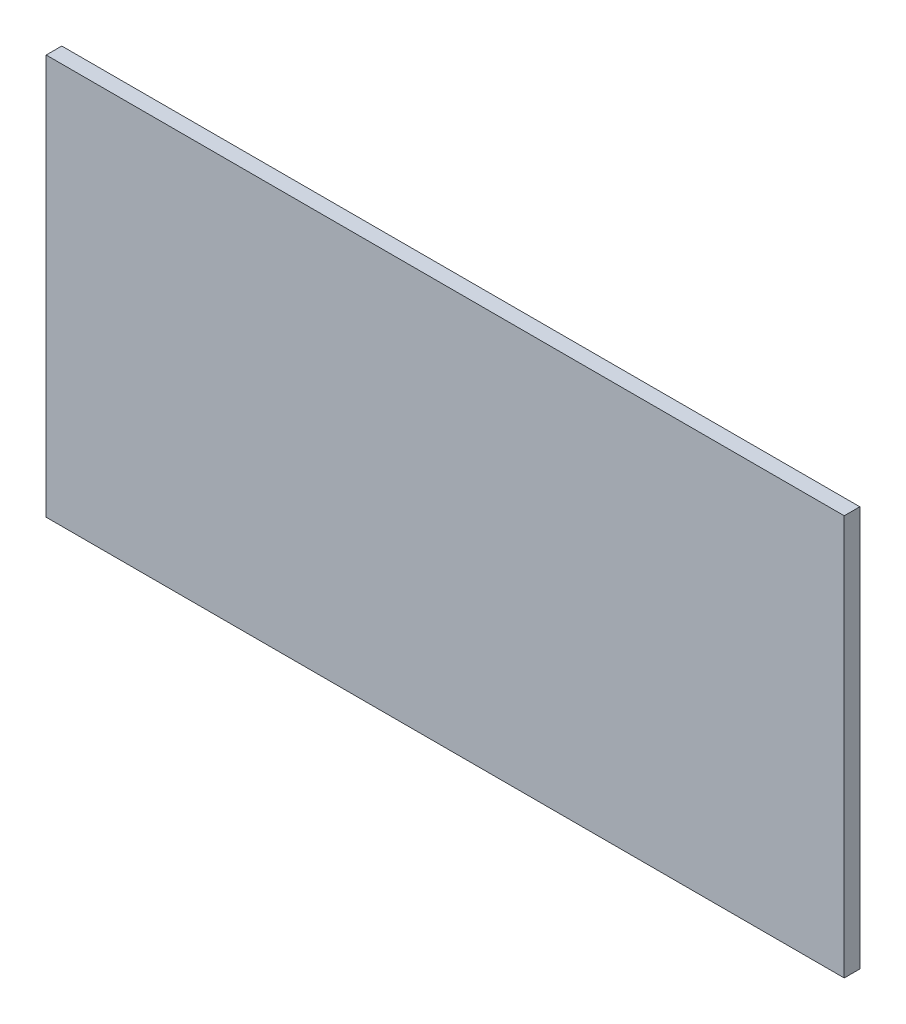
ISO-10303-21;
HEADER;
FILE_DESCRIPTION(('STEP AP214'),'2;1');
FILE_NAME('part.step','',(''),(''),'','','');
FILE_SCHEMA(('AUTOMOTIVE_DESIGN { 1 0 10303 214 1 1 1 1 }'));
ENDSEC;
DATA;
#1=APPLICATION_CONTEXT('core data for automotive mechanical design processes');
#2=APPLICATION_PROTOCOL_DEFINITION('international standard','automotive_design',2000,#1);
#3=PRODUCT_CONTEXT('',#1,'mechanical');
#4=PRODUCT('Part','Part','',(#3));
#5=PRODUCT_RELATED_PRODUCT_CATEGORY('part','',(#4));
#6=PRODUCT_DEFINITION_FORMATION('','',#4);
#7=PRODUCT_DEFINITION_CONTEXT('part definition',#1,'design');
#8=PRODUCT_DEFINITION('design','',#6,#7);
#9=PRODUCT_DEFINITION_SHAPE('','',#8);
#10=(LENGTH_UNIT() NAMED_UNIT(*) SI_UNIT(.MILLI.,.METRE.));
#11=(NAMED_UNIT(*) PLANE_ANGLE_UNIT() SI_UNIT($,.RADIAN.));
#12=(NAMED_UNIT(*) SI_UNIT($,.STERADIAN.) SOLID_ANGLE_UNIT());
#13=UNCERTAINTY_MEASURE_WITH_UNIT(LENGTH_MEASURE(1.E-05),#10,'distance_accuracy_value','');
#14=(GEOMETRIC_REPRESENTATION_CONTEXT(3) GLOBAL_UNCERTAINTY_ASSIGNED_CONTEXT((#13)) GLOBAL_UNIT_ASSIGNED_CONTEXT((#10,
#11,#12)) REPRESENTATION_CONTEXT('',''));
#15=CARTESIAN_POINT('',(0.,0.,0.));
#16=DIRECTION('',(0.,0.,1.));
#17=DIRECTION('',(1.,0.,0.));
#18=AXIS2_PLACEMENT_3D('',#15,#16,#17);
#19=CARTESIAN_POINT('',(153.5,77.,6.));
#20=DIRECTION('',(-1.,0.,0.));
#21=DIRECTION('',(0.,-1.,0.));
#22=AXIS2_PLACEMENT_3D('',#19,#20,#21);
#23=PLANE('',#22);
#24=DIRECTION('',(0.,1.,0.));
#25=VECTOR('',#24,1.);
#26=CARTESIAN_POINT('',(153.5,77.,0.));
#27=LINE('',#26,#25);
#28=CARTESIAN_POINT('',(153.5,-77.,0.));
#29=VERTEX_POINT('',#28);
#30=CARTESIAN_POINT('',(153.5,77.,0.));
#31=VERTEX_POINT('',#30);
#32=EDGE_CURVE('E98',#29,#31,#27,.T.);
#33=ORIENTED_EDGE('',*,*,#32,.T.);
#34=DIRECTION('',(0.,0.,-1.));
#35=VECTOR('',#34,1.);
#36=CARTESIAN_POINT('',(153.5,77.,6.));
#37=LINE('',#36,#35);
#38=CARTESIAN_POINT('',(153.5,77.,6.));
#39=VERTEX_POINT('',#38);
#40=EDGE_CURVE('E11',#39,#31,#37,.T.);
#41=ORIENTED_EDGE('',*,*,#40,.F.);
#42=DIRECTION('',(0.,1.,0.));
#43=VECTOR('',#42,1.);
#44=CARTESIAN_POINT('',(153.5,77.,6.));
#45=LINE('',#44,#43);
#46=CARTESIAN_POINT('',(153.5,-77.,6.));
#47=VERTEX_POINT('',#46);
#48=EDGE_CURVE('E86',#47,#39,#45,.T.);
#49=ORIENTED_EDGE('',*,*,#48,.F.);
#50=DIRECTION('',(0.,0.,-1.));
#51=VECTOR('',#50,1.);
#52=CARTESIAN_POINT('',(153.5,-77.,6.));
#53=LINE('',#52,#51);
#54=EDGE_CURVE('E94',#47,#29,#53,.T.);
#55=ORIENTED_EDGE('',*,*,#54,.T.);
#56=EDGE_LOOP('',(#33,#41,#49,#55));
#57=FACE_BOUND('',#56,.T.);
#58=ADVANCED_FACE('F35',(#57),#23,.F.);
#59=CARTESIAN_POINT('',(-153.5,77.,6.));
#60=DIRECTION('',(0.,-1.,0.));
#61=DIRECTION('',(0.,0.,-1.));
#62=AXIS2_PLACEMENT_3D('',#59,#60,#61);
#63=PLANE('',#62);
#64=DIRECTION('',(-1.,0.,0.));
#65=VECTOR('',#64,1.);
#66=CARTESIAN_POINT('',(-153.5,77.,0.));
#67=LINE('',#66,#65);
#68=CARTESIAN_POINT('',(-153.5,77.,0.));
#69=VERTEX_POINT('',#68);
#70=EDGE_CURVE('E90',#31,#69,#67,.T.);
#71=ORIENTED_EDGE('',*,*,#70,.T.);
#72=DIRECTION('',(0.,0.,-1.));
#73=VECTOR('',#72,1.);
#74=CARTESIAN_POINT('',(-153.5,77.,6.));
#75=LINE('',#74,#73);
#76=CARTESIAN_POINT('',(-153.5,77.,6.));
#77=VERTEX_POINT('',#76);
#78=EDGE_CURVE('E43',#77,#69,#75,.T.);
#79=ORIENTED_EDGE('',*,*,#78,.F.);
#80=DIRECTION('',(-1.,0.,0.));
#81=VECTOR('',#80,1.);
#82=CARTESIAN_POINT('',(-153.5,77.,6.));
#83=LINE('',#82,#81);
#84=EDGE_CURVE('E81',#39,#77,#83,.T.);
#85=ORIENTED_EDGE('',*,*,#84,.F.);
#86=ORIENTED_EDGE('',*,*,#40,.T.);
#87=EDGE_LOOP('',(#71,#79,#85,#86));
#88=FACE_BOUND('',#87,.T.);
#89=ADVANCED_FACE('F89',(#88),#63,.F.);
#90=CARTESIAN_POINT('',(-153.5,77.,6.));
#91=DIRECTION('',(1.,0.,0.));
#92=DIRECTION('',(0.,1.,0.));
#93=AXIS2_PLACEMENT_3D('',#90,#91,#92);
#94=PLANE('',#93);
#95=DIRECTION('',(0.,-1.,0.));
#96=VECTOR('',#95,1.);
#97=CARTESIAN_POINT('',(-153.5,77.,0.));
#98=LINE('',#97,#96);
#99=CARTESIAN_POINT('',(-153.5,-77.,0.));
#100=VERTEX_POINT('',#99);
#101=EDGE_CURVE('E68',#69,#100,#98,.T.);
#102=ORIENTED_EDGE('',*,*,#101,.T.);
#103=DIRECTION('',(0.,0.,-1.));
#104=VECTOR('',#103,1.);
#105=CARTESIAN_POINT('',(-153.5,-77.,6.));
#106=LINE('',#105,#104);
#107=CARTESIAN_POINT('',(-153.5,-77.,6.));
#108=VERTEX_POINT('',#107);
#109=EDGE_CURVE('E91',#108,#100,#106,.T.);
#110=ORIENTED_EDGE('',*,*,#109,.F.);
#111=DIRECTION('',(0.,-1.,0.));
#112=VECTOR('',#111,1.);
#113=CARTESIAN_POINT('',(-153.5,77.,6.));
#114=LINE('',#113,#112);
#115=EDGE_CURVE('E84',#77,#108,#114,.T.);
#116=ORIENTED_EDGE('',*,*,#115,.F.);
#117=ORIENTED_EDGE('',*,*,#78,.T.);
#118=EDGE_LOOP('',(#102,#110,#116,#117));
#119=FACE_BOUND('',#118,.T.);
#120=ADVANCED_FACE('F92',(#119),#94,.F.);
#121=CARTESIAN_POINT('',(-153.5,-77.,6.));
#122=DIRECTION('',(0.,1.,0.));
#123=DIRECTION('',(0.,0.,1.));
#124=AXIS2_PLACEMENT_3D('',#121,#122,#123);
#125=PLANE('',#124);
#126=DIRECTION('',(1.,0.,0.));
#127=VECTOR('',#126,1.);
#128=CARTESIAN_POINT('',(-153.5,-77.,0.));
#129=LINE('',#128,#127);
#130=EDGE_CURVE('E74',#100,#29,#129,.T.);
#131=ORIENTED_EDGE('',*,*,#130,.T.);
#132=ORIENTED_EDGE('',*,*,#54,.F.);
#133=DIRECTION('',(1.,0.,0.));
#134=VECTOR('',#133,1.);
#135=CARTESIAN_POINT('',(-153.5,-77.,6.));
#136=LINE('',#135,#134);
#137=EDGE_CURVE('E51',#108,#47,#136,.T.);
#138=ORIENTED_EDGE('',*,*,#137,.F.);
#139=ORIENTED_EDGE('',*,*,#109,.T.);
#140=EDGE_LOOP('',(#131,#132,#138,#139));
#141=FACE_BOUND('',#140,.T.);
#142=ADVANCED_FACE('F105',(#141),#125,.F.);
#143=CARTESIAN_POINT('',(0.,0.,6.));
#144=DIRECTION('',(0.,0.,1.));
#145=DIRECTION('',(1.,0.,0.));
#146=AXIS2_PLACEMENT_3D('',#143,#144,#145);
#147=PLANE('',#146);
#148=ORIENTED_EDGE('',*,*,#48,.T.);
#149=ORIENTED_EDGE('',*,*,#84,.T.);
#150=ORIENTED_EDGE('',*,*,#115,.T.);
#151=ORIENTED_EDGE('',*,*,#137,.T.);
#152=EDGE_LOOP('',(#148,#149,#150,#151));
#153=FACE_BOUND('',#152,.T.);
#154=ADVANCED_FACE('F82',(#153),#147,.T.);
#155=CARTESIAN_POINT('',(0.,0.,0.));
#156=DIRECTION('',(0.,0.,1.));
#157=DIRECTION('',(1.,0.,0.));
#158=AXIS2_PLACEMENT_3D('',#155,#156,#157);
#159=PLANE('',#158);
#160=ORIENTED_EDGE('',*,*,#32,.F.);
#161=ORIENTED_EDGE('',*,*,#130,.F.);
#162=ORIENTED_EDGE('',*,*,#101,.F.);
#163=ORIENTED_EDGE('',*,*,#70,.F.);
#164=EDGE_LOOP('',(#160,#161,#162,#163));
#165=FACE_BOUND('',#164,.T.);
#166=ADVANCED_FACE('F108',(#165),#159,.F.);
#167=CLOSED_SHELL('',(#58,#89,#120,#142,#154,#166));
#168=MANIFOLD_SOLID_BREP('B2',#167);
#169=ADVANCED_BREP_SHAPE_REPRESENTATION('',(#18,#168),#14);
#170=SHAPE_DEFINITION_REPRESENTATION(#9,#169);
ENDSEC;
END-ISO-10303-21;
